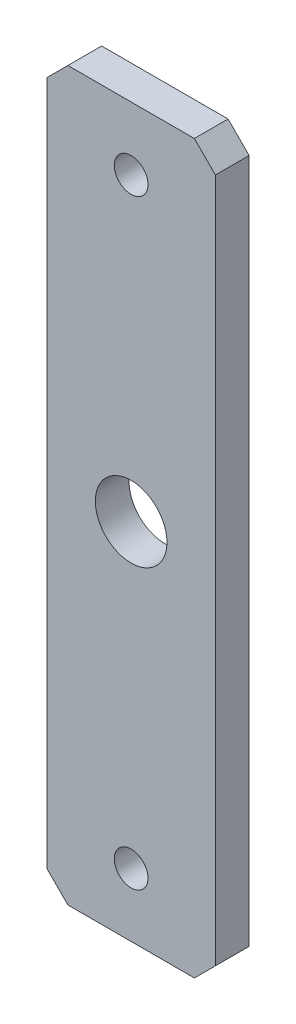
ISO-10303-21;
HEADER;
FILE_DESCRIPTION(('STEP AP214'),'2;1');
FILE_NAME('part.step','',(''),(''),'','','');
FILE_SCHEMA(('AUTOMOTIVE_DESIGN { 1 0 10303 214 1 1 1 1 }'));
ENDSEC;
DATA;
#1=APPLICATION_CONTEXT('core data for automotive mechanical design processes');
#2=APPLICATION_PROTOCOL_DEFINITION('international standard','automotive_design',2000,#1);
#3=PRODUCT_CONTEXT('',#1,'mechanical');
#4=PRODUCT('Part','Part','',(#3));
#5=PRODUCT_RELATED_PRODUCT_CATEGORY('part','',(#4));
#6=PRODUCT_DEFINITION_FORMATION('','',#4);
#7=PRODUCT_DEFINITION_CONTEXT('part definition',#1,'design');
#8=PRODUCT_DEFINITION('design','',#6,#7);
#9=PRODUCT_DEFINITION_SHAPE('','',#8);
#10=(LENGTH_UNIT() NAMED_UNIT(*) SI_UNIT(.MILLI.,.METRE.));
#11=(NAMED_UNIT(*) PLANE_ANGLE_UNIT() SI_UNIT($,.RADIAN.));
#12=(NAMED_UNIT(*) SI_UNIT($,.STERADIAN.) SOLID_ANGLE_UNIT());
#13=UNCERTAINTY_MEASURE_WITH_UNIT(LENGTH_MEASURE(1.E-05),#10,'distance_accuracy_value','');
#14=(GEOMETRIC_REPRESENTATION_CONTEXT(3) GLOBAL_UNCERTAINTY_ASSIGNED_CONTEXT((#13)) GLOBAL_UNIT_ASSIGNED_CONTEXT((#10,
#11,#12)) REPRESENTATION_CONTEXT('',''));
#15=CARTESIAN_POINT('',(0.,0.,0.));
#16=DIRECTION('',(0.,0.,1.));
#17=DIRECTION('',(1.,0.,0.));
#18=AXIS2_PLACEMENT_3D('',#15,#16,#17);
#19=CARTESIAN_POINT('',(0.,0.,16.));
#20=DIRECTION('',(1.,0.,0.));
#21=DIRECTION('',(0.,0.,-1.));
#22=AXIS2_PLACEMENT_3D('',#19,#20,#21);
#23=PLANE('',#22);
#24=DIRECTION('',(0.,-1.,0.));
#25=VECTOR('',#24,1.);
#26=CARTESIAN_POINT('',(0.,0.,0.));
#27=LINE('',#26,#25);
#28=CARTESIAN_POINT('',(0.,335.,0.));
#29=VERTEX_POINT('',#28);
#30=CARTESIAN_POINT('',(0.,10.0000000000001,0.));
#31=VERTEX_POINT('',#30);
#32=EDGE_CURVE('E128',#29,#31,#27,.T.);
#33=ORIENTED_EDGE('',*,*,#32,.T.);
#34=DIRECTION('',(0.,0.,1.));
#35=VECTOR('',#34,1.);
#36=CARTESIAN_POINT('',(0.,10.0000000000001,16.));
#37=LINE('',#36,#35);
#38=CARTESIAN_POINT('',(0.,10.0000000000001,16.));
#39=VERTEX_POINT('',#38);
#40=EDGE_CURVE('E106',#31,#39,#37,.T.);
#41=ORIENTED_EDGE('',*,*,#40,.T.);
#42=DIRECTION('',(0.,-1.,0.));
#43=VECTOR('',#42,1.);
#44=CARTESIAN_POINT('',(0.,0.,16.));
#45=LINE('',#44,#43);
#46=CARTESIAN_POINT('',(0.,335.,16.));
#47=VERTEX_POINT('',#46);
#48=EDGE_CURVE('E138',#47,#39,#45,.T.);
#49=ORIENTED_EDGE('',*,*,#48,.F.);
#50=DIRECTION('',(0.,0.,-1.));
#51=VECTOR('',#50,1.);
#52=CARTESIAN_POINT('',(0.,335.,16.));
#53=LINE('',#52,#51);
#54=EDGE_CURVE('E111',#47,#29,#53,.T.);
#55=ORIENTED_EDGE('',*,*,#54,.T.);
#56=EDGE_LOOP('',(#33,#41,#49,#55));
#57=FACE_BOUND('',#56,.T.);
#58=ADVANCED_FACE('F35',(#57),#23,.F.);
#59=CARTESIAN_POINT('',(0.,0.,16.));
#60=DIRECTION('',(0.,1.,0.));
#61=DIRECTION('',(0.,0.,1.));
#62=AXIS2_PLACEMENT_3D('',#59,#60,#61);
#63=PLANE('',#62);
#64=DIRECTION('',(1.,0.,0.));
#65=VECTOR('',#64,1.);
#66=CARTESIAN_POINT('',(0.,0.,16.));
#67=LINE('',#66,#65);
#68=CARTESIAN_POINT('',(10.0000000000001,0.,16.));
#69=VERTEX_POINT('',#68);
#70=CARTESIAN_POINT('',(69.9999999999999,0.,16.));
#71=VERTEX_POINT('',#70);
#72=EDGE_CURVE('E121',#69,#71,#67,.T.);
#73=ORIENTED_EDGE('',*,*,#72,.F.);
#74=DIRECTION('',(0.,0.,-1.));
#75=VECTOR('',#74,1.);
#76=CARTESIAN_POINT('',(10.0000000000001,0.,16.));
#77=LINE('',#76,#75);
#78=CARTESIAN_POINT('',(10.0000000000001,0.,0.));
#79=VERTEX_POINT('',#78);
#80=EDGE_CURVE('E105',#69,#79,#77,.T.);
#81=ORIENTED_EDGE('',*,*,#80,.T.);
#82=DIRECTION('',(1.,0.,0.));
#83=VECTOR('',#82,1.);
#84=CARTESIAN_POINT('',(0.,0.,0.));
#85=LINE('',#84,#83);
#86=CARTESIAN_POINT('',(69.9999999999999,0.,0.));
#87=VERTEX_POINT('',#86);
#88=EDGE_CURVE('E118',#79,#87,#85,.T.);
#89=ORIENTED_EDGE('',*,*,#88,.T.);
#90=DIRECTION('',(0.,0.,1.));
#91=VECTOR('',#90,1.);
#92=CARTESIAN_POINT('',(69.9999999999999,0.,16.));
#93=LINE('',#92,#91);
#94=EDGE_CURVE('E123',#87,#71,#93,.T.);
#95=ORIENTED_EDGE('',*,*,#94,.T.);
#96=EDGE_LOOP('',(#73,#81,#89,#95));
#97=FACE_BOUND('',#96,.T.);
#98=ADVANCED_FACE('F117',(#97),#63,.F.);
#99=CARTESIAN_POINT('',(80.,0.,16.));
#100=DIRECTION('',(-1.,0.,0.));
#101=DIRECTION('',(0.,0.,1.));
#102=AXIS2_PLACEMENT_3D('',#99,#100,#101);
#103=PLANE('',#102);
#104=DIRECTION('',(0.,1.,0.));
#105=VECTOR('',#104,1.);
#106=CARTESIAN_POINT('',(80.,0.,16.));
#107=LINE('',#106,#105);
#108=CARTESIAN_POINT('',(80.,10.0000000000001,16.));
#109=VERTEX_POINT('',#108);
#110=CARTESIAN_POINT('',(80.,335.,16.));
#111=VERTEX_POINT('',#110);
#112=EDGE_CURVE('E169',#109,#111,#107,.T.);
#113=ORIENTED_EDGE('',*,*,#112,.F.);
#114=DIRECTION('',(0.,0.,-1.));
#115=VECTOR('',#114,1.);
#116=CARTESIAN_POINT('',(80.,10.0000000000001,16.));
#117=LINE('',#116,#115);
#118=CARTESIAN_POINT('',(80.,10.0000000000001,0.));
#119=VERTEX_POINT('',#118);
#120=EDGE_CURVE('E162',#109,#119,#117,.T.);
#121=ORIENTED_EDGE('',*,*,#120,.T.);
#122=DIRECTION('',(0.,1.,0.));
#123=VECTOR('',#122,1.);
#124=CARTESIAN_POINT('',(80.,0.,0.));
#125=LINE('',#124,#123);
#126=CARTESIAN_POINT('',(80.,335.,0.));
#127=VERTEX_POINT('',#126);
#128=EDGE_CURVE('E127',#119,#127,#125,.T.);
#129=ORIENTED_EDGE('',*,*,#128,.T.);
#130=DIRECTION('',(0.,0.,1.));
#131=VECTOR('',#130,1.);
#132=CARTESIAN_POINT('',(80.,335.,16.));
#133=LINE('',#132,#131);
#134=EDGE_CURVE('E160',#127,#111,#133,.T.);
#135=ORIENTED_EDGE('',*,*,#134,.T.);
#136=EDGE_LOOP('',(#113,#121,#129,#135));
#137=FACE_BOUND('',#136,.T.);
#138=ADVANCED_FACE('F167',(#137),#103,.F.);
#139=CARTESIAN_POINT('',(0.,345.,16.));
#140=DIRECTION('',(0.,-1.,0.));
#141=DIRECTION('',(0.,0.,-1.));
#142=AXIS2_PLACEMENT_3D('',#139,#140,#141);
#143=PLANE('',#142);
#144=DIRECTION('',(-1.,0.,0.));
#145=VECTOR('',#144,1.);
#146=CARTESIAN_POINT('',(0.,345.,16.));
#147=LINE('',#146,#145);
#148=CARTESIAN_POINT('',(70.0000000000001,345.,16.));
#149=VERTEX_POINT('',#148);
#150=CARTESIAN_POINT('',(10.0000000000001,345.,16.));
#151=VERTEX_POINT('',#150);
#152=EDGE_CURVE('E144',#149,#151,#147,.T.);
#153=ORIENTED_EDGE('',*,*,#152,.F.);
#154=DIRECTION('',(0.,0.,-1.));
#155=VECTOR('',#154,1.);
#156=CARTESIAN_POINT('',(70.0000000000001,345.,16.));
#157=LINE('',#156,#155);
#158=CARTESIAN_POINT('',(70.0000000000001,345.,0.));
#159=VERTEX_POINT('',#158);
#160=EDGE_CURVE('E11',#149,#159,#157,.T.);
#161=ORIENTED_EDGE('',*,*,#160,.T.);
#162=DIRECTION('',(-1.,0.,0.));
#163=VECTOR('',#162,1.);
#164=CARTESIAN_POINT('',(0.,345.,0.));
#165=LINE('',#164,#163);
#166=CARTESIAN_POINT('',(10.0000000000001,345.,0.));
#167=VERTEX_POINT('',#166);
#168=EDGE_CURVE('E131',#159,#167,#165,.T.);
#169=ORIENTED_EDGE('',*,*,#168,.T.);
#170=DIRECTION('',(0.,0.,1.));
#171=VECTOR('',#170,1.);
#172=CARTESIAN_POINT('',(10.0000000000001,345.,16.));
#173=LINE('',#172,#171);
#174=EDGE_CURVE('E43',#167,#151,#173,.T.);
#175=ORIENTED_EDGE('',*,*,#174,.T.);
#176=EDGE_LOOP('',(#153,#161,#169,#175));
#177=FACE_BOUND('',#176,.T.);
#178=ADVANCED_FACE('F176',(#177),#143,.F.);
#179=CARTESIAN_POINT('',(0.,0.,16.));
#180=DIRECTION('',(0.,0.,-1.));
#181=DIRECTION('',(-1.,0.,0.));
#182=AXIS2_PLACEMENT_3D('',#179,#180,#181);
#183=PLANE('',#182);
#184=CARTESIAN_POINT('',(40.,172.5,16.));
#185=DIRECTION('',(0.,0.,1.));
#186=DIRECTION('',(1.,0.,0.));
#187=AXIS2_PLACEMENT_3D('',#184,#185,#186);
#188=CIRCLE('',#187,17.);
#189=CARTESIAN_POINT('',(57.,172.5,16.));
#190=VERTEX_POINT('',#189);
#191=EDGE_CURVE('E192',#190,#190,#188,.T.);
#192=ORIENTED_EDGE('',*,*,#191,.F.);
#193=EDGE_LOOP('',(#192));
#194=FACE_BOUND('',#193,.T.);
#195=CARTESIAN_POINT('',(40.,315.,16.));
#196=DIRECTION('',(0.,0.,1.));
#197=DIRECTION('',(1.,0.,0.));
#198=AXIS2_PLACEMENT_3D('',#195,#196,#197);
#199=CIRCLE('',#198,7.99999999999999);
#200=CARTESIAN_POINT('',(48.,315.,16.));
#201=VERTEX_POINT('',#200);
#202=EDGE_CURVE('E143',#201,#201,#199,.T.);
#203=ORIENTED_EDGE('',*,*,#202,.F.);
#204=EDGE_LOOP('',(#203));
#205=FACE_BOUND('',#204,.T.);
#206=CARTESIAN_POINT('',(40.,30.,16.));
#207=DIRECTION('',(0.,0.,1.));
#208=DIRECTION('',(1.,0.,0.));
#209=AXIS2_PLACEMENT_3D('',#206,#207,#208);
#210=CIRCLE('',#209,7.99999999999999);
#211=CARTESIAN_POINT('',(48.,30.,16.));
#212=VERTEX_POINT('',#211);
#213=EDGE_CURVE('E142',#212,#212,#210,.T.);
#214=ORIENTED_EDGE('',*,*,#213,.F.);
#215=EDGE_LOOP('',(#214));
#216=FACE_BOUND('',#215,.T.);
#217=ORIENTED_EDGE('',*,*,#48,.T.);
#218=DIRECTION('',(-0.707106781186546,0.707106781186549,0.));
#219=VECTOR('',#218,1.);
#220=CARTESIAN_POINT('',(10.0000000000001,0.,16.));
#221=LINE('',#220,#219);
#222=EDGE_CURVE('E158',#39,#69,#221,.F.);
#223=ORIENTED_EDGE('',*,*,#222,.T.);
#224=ORIENTED_EDGE('',*,*,#72,.T.);
#225=DIRECTION('',(-0.707106781186549,-0.707106781186546,0.));
#226=VECTOR('',#225,1.);
#227=CARTESIAN_POINT('',(80.,10.0000000000001,16.));
#228=LINE('',#227,#226);
#229=EDGE_CURVE('E156',#71,#109,#228,.F.);
#230=ORIENTED_EDGE('',*,*,#229,.T.);
#231=ORIENTED_EDGE('',*,*,#112,.T.);
#232=DIRECTION('',(0.707106781186546,-0.707106781186549,0.));
#233=VECTOR('',#232,1.);
#234=CARTESIAN_POINT('',(70.0000000000001,345.,16.));
#235=LINE('',#234,#233);
#236=EDGE_CURVE('E56',#111,#149,#235,.F.);
#237=ORIENTED_EDGE('',*,*,#236,.T.);
#238=ORIENTED_EDGE('',*,*,#152,.T.);
#239=DIRECTION('',(0.707106781186551,0.707106781186544,0.));
#240=VECTOR('',#239,1.);
#241=CARTESIAN_POINT('',(0.,335.,16.));
#242=LINE('',#241,#240);
#243=EDGE_CURVE('E153',#151,#47,#242,.F.);
#244=ORIENTED_EDGE('',*,*,#243,.T.);
#245=EDGE_LOOP('',(#217,#223,#224,#230,#231,#237,#238,#244));
#246=FACE_BOUND('',#245,.T.);
#247=ADVANCED_FACE('F198',(#194,#205,#216,#246),#183,.F.);
#248=CARTESIAN_POINT('',(0.,0.,0.));
#249=DIRECTION('',(0.,0.,-1.));
#250=DIRECTION('',(-1.,0.,0.));
#251=AXIS2_PLACEMENT_3D('',#248,#249,#250);
#252=PLANE('',#251);
#253=CARTESIAN_POINT('',(40.,172.5,0.));
#254=DIRECTION('',(0.,0.,1.));
#255=DIRECTION('',(1.,0.,0.));
#256=AXIS2_PLACEMENT_3D('',#253,#254,#255);
#257=CIRCLE('',#256,17.);
#258=CARTESIAN_POINT('',(57.,172.5,0.));
#259=VERTEX_POINT('',#258);
#260=EDGE_CURVE('E189',#259,#259,#257,.T.);
#261=ORIENTED_EDGE('',*,*,#260,.T.);
#262=EDGE_LOOP('',(#261));
#263=FACE_BOUND('',#262,.T.);
#264=CARTESIAN_POINT('',(40.,315.,0.));
#265=DIRECTION('',(0.,0.,-1.));
#266=DIRECTION('',(-1.,0.,0.));
#267=AXIS2_PLACEMENT_3D('',#264,#265,#266);
#268=CIRCLE('',#267,7.99999999999999);
#269=CARTESIAN_POINT('',(32.,315.,0.));
#270=VERTEX_POINT('',#269);
#271=EDGE_CURVE('E139',#270,#270,#268,.T.);
#272=ORIENTED_EDGE('',*,*,#271,.F.);
#273=EDGE_LOOP('',(#272));
#274=FACE_BOUND('',#273,.T.);
#275=CARTESIAN_POINT('',(40.,30.,0.));
#276=DIRECTION('',(0.,0.,-1.));
#277=DIRECTION('',(-1.,0.,0.));
#278=AXIS2_PLACEMENT_3D('',#275,#276,#277);
#279=CIRCLE('',#278,7.99999999999999);
#280=CARTESIAN_POINT('',(32.,30.,0.));
#281=VERTEX_POINT('',#280);
#282=EDGE_CURVE('E133',#281,#281,#279,.T.);
#283=ORIENTED_EDGE('',*,*,#282,.F.);
#284=EDGE_LOOP('',(#283));
#285=FACE_BOUND('',#284,.T.);
#286=ORIENTED_EDGE('',*,*,#88,.F.);
#287=DIRECTION('',(0.707106781186546,-0.707106781186549,0.));
#288=VECTOR('',#287,1.);
#289=CARTESIAN_POINT('',(5.00000000000006,5.00000000000003,0.));
#290=LINE('',#289,#288);
#291=EDGE_CURVE('E101',#79,#31,#290,.F.);
#292=ORIENTED_EDGE('',*,*,#291,.T.);
#293=ORIENTED_EDGE('',*,*,#32,.F.);
#294=DIRECTION('',(-0.707106781186551,-0.707106781186544,0.));
#295=VECTOR('',#294,1.);
#296=CARTESIAN_POINT('',(-167.5,167.500000000002,0.));
#297=LINE('',#296,#295);
#298=EDGE_CURVE('E122',#29,#167,#297,.F.);
#299=ORIENTED_EDGE('',*,*,#298,.T.);
#300=ORIENTED_EDGE('',*,*,#168,.F.);
#301=DIRECTION('',(-0.707106781186546,0.707106781186549,0.));
#302=VECTOR('',#301,1.);
#303=CARTESIAN_POINT('',(207.5,207.499999999999,0.));
#304=LINE('',#303,#302);
#305=EDGE_CURVE('E147',#159,#127,#304,.F.);
#306=ORIENTED_EDGE('',*,*,#305,.T.);
#307=ORIENTED_EDGE('',*,*,#128,.F.);
#308=DIRECTION('',(0.707106781186549,0.707106781186546,0.));
#309=VECTOR('',#308,1.);
#310=CARTESIAN_POINT('',(34.9999999999998,-35.,0.));
#311=LINE('',#310,#309);
#312=EDGE_CURVE('E112',#119,#87,#311,.F.);
#313=ORIENTED_EDGE('',*,*,#312,.T.);
#314=EDGE_LOOP('',(#286,#292,#293,#299,#300,#306,#307,#313));
#315=FACE_BOUND('',#314,.T.);
#316=ADVANCED_FACE('F125',(#263,#274,#285,#315),#252,.T.);
#317=CARTESIAN_POINT('',(40.,30.,16.));
#318=DIRECTION('',(0.,0.,1.));
#319=DIRECTION('',(1.,0.,0.));
#320=AXIS2_PLACEMENT_3D('',#317,#318,#319);
#321=CYLINDRICAL_SURFACE('',#320,7.99999999999999);
#322=ORIENTED_EDGE('',*,*,#282,.T.);
#323=EDGE_LOOP('',(#322));
#324=FACE_BOUND('',#323,.T.);
#325=ORIENTED_EDGE('',*,*,#213,.T.);
#326=EDGE_LOOP('',(#325));
#327=FACE_BOUND('',#326,.T.);
#328=ADVANCED_FACE('F257',(#324,#327),#321,.F.);
#329=CARTESIAN_POINT('',(40.,315.,16.));
#330=DIRECTION('',(0.,0.,1.));
#331=DIRECTION('',(1.,0.,0.));
#332=AXIS2_PLACEMENT_3D('',#329,#330,#331);
#333=CYLINDRICAL_SURFACE('',#332,7.99999999999999);
#334=ORIENTED_EDGE('',*,*,#271,.T.);
#335=EDGE_LOOP('',(#334));
#336=FACE_BOUND('',#335,.T.);
#337=ORIENTED_EDGE('',*,*,#202,.T.);
#338=EDGE_LOOP('',(#337));
#339=FACE_BOUND('',#338,.T.);
#340=ADVANCED_FACE('F228',(#336,#339),#333,.F.);
#341=CARTESIAN_POINT('',(10.0000000000001,0.,16.));
#342=DIRECTION('',(0.707106781186549,0.707106781186546,0.));
#343=DIRECTION('',(0.,0.,-1.));
#344=AXIS2_PLACEMENT_3D('',#341,#342,#343);
#345=PLANE('',#344);
#346=ORIENTED_EDGE('',*,*,#222,.F.);
#347=ORIENTED_EDGE('',*,*,#40,.F.);
#348=ORIENTED_EDGE('',*,*,#291,.F.);
#349=ORIENTED_EDGE('',*,*,#80,.F.);
#350=EDGE_LOOP('',(#346,#347,#348,#349));
#351=FACE_BOUND('',#350,.T.);
#352=ADVANCED_FACE('F104',(#351),#345,.F.);
#353=CARTESIAN_POINT('',(80.,10.0000000000001,16.));
#354=DIRECTION('',(-0.707106781186546,0.707106781186549,0.));
#355=DIRECTION('',(0.,0.,-1.));
#356=AXIS2_PLACEMENT_3D('',#353,#354,#355);
#357=PLANE('',#356);
#358=ORIENTED_EDGE('',*,*,#229,.F.);
#359=ORIENTED_EDGE('',*,*,#94,.F.);
#360=ORIENTED_EDGE('',*,*,#312,.F.);
#361=ORIENTED_EDGE('',*,*,#120,.F.);
#362=EDGE_LOOP('',(#358,#359,#360,#361));
#363=FACE_BOUND('',#362,.T.);
#364=ADVANCED_FACE('F216',(#363),#357,.F.);
#365=CARTESIAN_POINT('',(70.0000000000001,345.,16.));
#366=DIRECTION('',(-0.707106781186549,-0.707106781186546,0.));
#367=DIRECTION('',(0.,0.,-1.));
#368=AXIS2_PLACEMENT_3D('',#365,#366,#367);
#369=PLANE('',#368);
#370=ORIENTED_EDGE('',*,*,#236,.F.);
#371=ORIENTED_EDGE('',*,*,#134,.F.);
#372=ORIENTED_EDGE('',*,*,#305,.F.);
#373=ORIENTED_EDGE('',*,*,#160,.F.);
#374=EDGE_LOOP('',(#370,#371,#372,#373));
#375=FACE_BOUND('',#374,.T.);
#376=ADVANCED_FACE('F175',(#375),#369,.F.);
#377=CARTESIAN_POINT('',(0.,335.,16.));
#378=DIRECTION('',(0.707106781186544,-0.707106781186551,0.));
#379=DIRECTION('',(0.,0.,-1.));
#380=AXIS2_PLACEMENT_3D('',#377,#378,#379);
#381=PLANE('',#380);
#382=ORIENTED_EDGE('',*,*,#243,.F.);
#383=ORIENTED_EDGE('',*,*,#174,.F.);
#384=ORIENTED_EDGE('',*,*,#298,.F.);
#385=ORIENTED_EDGE('',*,*,#54,.F.);
#386=EDGE_LOOP('',(#382,#383,#384,#385));
#387=FACE_BOUND('',#386,.T.);
#388=ADVANCED_FACE('F37',(#387),#381,.F.);
#389=CARTESIAN_POINT('',(40.,172.5,16.));
#390=DIRECTION('',(0.,0.,1.));
#391=DIRECTION('',(1.,0.,0.));
#392=AXIS2_PLACEMENT_3D('',#389,#390,#391);
#393=CYLINDRICAL_SURFACE('',#392,17.);
#394=ORIENTED_EDGE('',*,*,#260,.F.);
#395=EDGE_LOOP('',(#394));
#396=FACE_BOUND('',#395,.T.);
#397=ORIENTED_EDGE('',*,*,#191,.T.);
#398=EDGE_LOOP('',(#397));
#399=FACE_BOUND('',#398,.T.);
#400=ADVANCED_FACE('F196',(#396,#399),#393,.F.);
#401=CLOSED_SHELL('',(#58,#98,#138,#178,#247,#316,#328,#340,#352,#364,#376,#388,#400));
#402=MANIFOLD_SOLID_BREP('B2',#401);
#403=ADVANCED_BREP_SHAPE_REPRESENTATION('',(#18,#402),#14);
#404=SHAPE_DEFINITION_REPRESENTATION(#9,#403);
ENDSEC;
END-ISO-10303-21;
